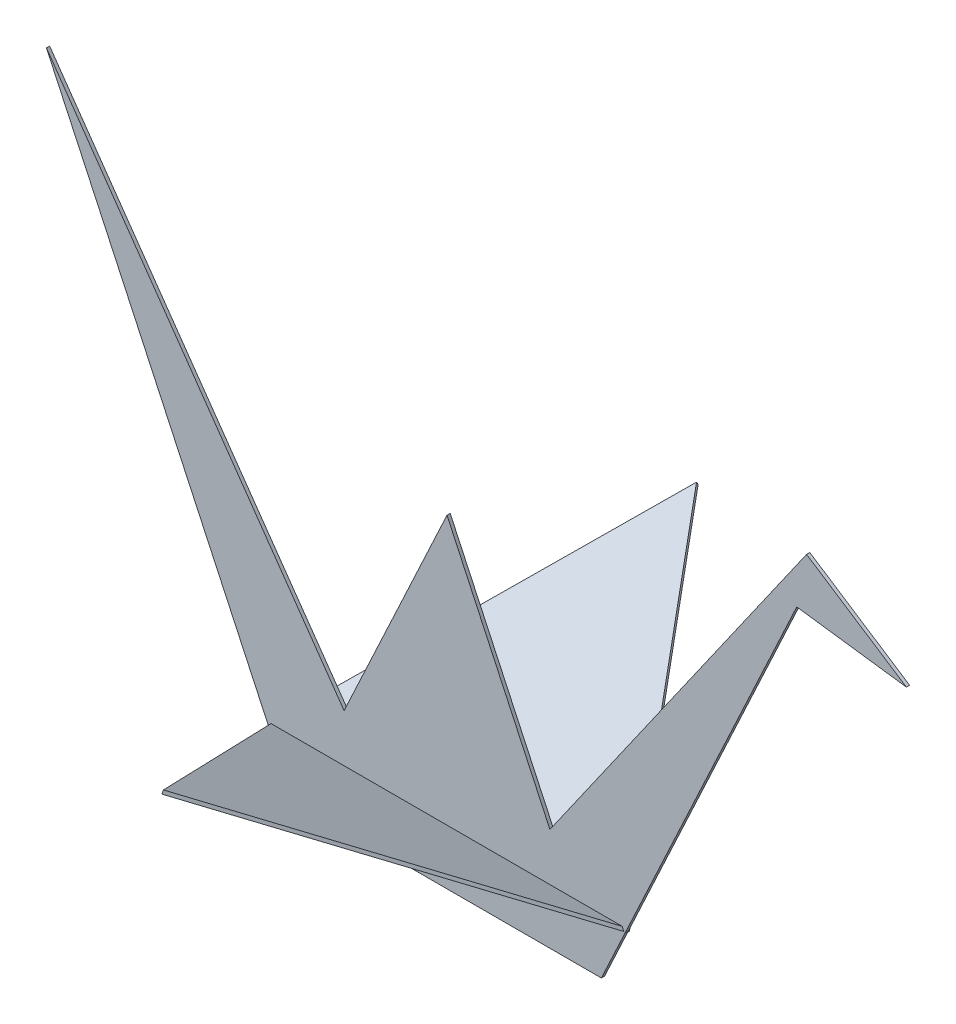
ISO-10303-21;
HEADER;
FILE_DESCRIPTION(('STEP AP214'),'2;1');
FILE_NAME('part.step','',(''),(''),'','','');
FILE_SCHEMA(('AUTOMOTIVE_DESIGN { 1 0 10303 214 1 1 1 1 }'));
ENDSEC;
DATA;
#1=APPLICATION_CONTEXT('core data for automotive mechanical design processes');
#2=APPLICATION_PROTOCOL_DEFINITION('international standard','automotive_design',2000,#1);
#3=PRODUCT_CONTEXT('',#1,'mechanical');
#4=PRODUCT('Part','Part','',(#3));
#5=PRODUCT_RELATED_PRODUCT_CATEGORY('part','',(#4));
#6=PRODUCT_DEFINITION_FORMATION('','',#4);
#7=PRODUCT_DEFINITION_CONTEXT('part definition',#1,'design');
#8=PRODUCT_DEFINITION('design','',#6,#7);
#9=PRODUCT_DEFINITION_SHAPE('','',#8);
#10=(LENGTH_UNIT() NAMED_UNIT(*) SI_UNIT(.MILLI.,.METRE.));
#11=(NAMED_UNIT(*) PLANE_ANGLE_UNIT() SI_UNIT($,.RADIAN.));
#12=(NAMED_UNIT(*) SI_UNIT($,.STERADIAN.) SOLID_ANGLE_UNIT());
#13=UNCERTAINTY_MEASURE_WITH_UNIT(LENGTH_MEASURE(1.E-05),#10,'distance_accuracy_value','');
#14=(GEOMETRIC_REPRESENTATION_CONTEXT(3) GLOBAL_UNCERTAINTY_ASSIGNED_CONTEXT((#13)) GLOBAL_UNIT_ASSIGNED_CONTEXT((#10,
#11,#12)) REPRESENTATION_CONTEXT('',''));
#15=CARTESIAN_POINT('',(0.,0.,0.));
#16=DIRECTION('',(0.,0.,1.));
#17=DIRECTION('',(1.,0.,0.));
#18=AXIS2_PLACEMENT_3D('',#15,#16,#17);
#19=CARTESIAN_POINT('',(0.,0.,6.35));
#20=DIRECTION('',(0.,0.,1.));
#21=DIRECTION('',(1.,0.,0.));
#22=AXIS2_PLACEMENT_3D('',#19,#20,#21);
#23=PLANE('',#22);
#24=DIRECTION('',(0.422618261740697,-0.906307787036651,0.));
#25=VECTOR('',#24,1.);
#26=CARTESIAN_POINT('',(-791.008562204168,1042.67762645785,6.35));
#27=LINE('',#26,#25);
#28=CARTESIAN_POINT('',(-791.008562204168,1042.67762645785,6.35));
#29=VERTEX_POINT('',#28);
#30=CARTESIAN_POINT('',(-304.8,0.,6.35));
#31=VERTEX_POINT('',#30);
#32=EDGE_CURVE('E356',#29,#31,#27,.T.);
#33=ORIENTED_EDGE('',*,*,#32,.T.);
#34=DIRECTION('',(1.,0.,0.));
#35=VECTOR('',#34,1.);
#36=CARTESIAN_POINT('',(-304.8,0.,6.35));
#37=LINE('',#36,#35);
#38=CARTESIAN_POINT('',(304.8,0.,6.35));
#39=VERTEX_POINT('',#38);
#40=EDGE_CURVE('E360',#31,#39,#37,.T.);
#41=ORIENTED_EDGE('',*,*,#40,.T.);
#42=DIRECTION('',(0.422618261740697,0.906307787036651,0.));
#43=VECTOR('',#42,1.);
#44=CARTESIAN_POINT('',(304.8,0.,6.35));
#45=LINE('',#44,#43);
#46=CARTESIAN_POINT('',(690.659261150894,827.477855880803,6.35));
#47=VERTEX_POINT('',#46);
#48=EDGE_CURVE('E364',#39,#47,#45,.T.);
#49=ORIENTED_EDGE('',*,*,#48,.T.);
#50=DIRECTION('',(0.991183026101507,-0.132499844408433,0.));
#51=VECTOR('',#50,1.);
#52=CARTESIAN_POINT('',(690.659261150894,827.477855880803,6.35));
#53=LINE('',#52,#51);
#54=CARTESIAN_POINT('',(907.061590086434,798.549520590036,6.35));
#55=VERTEX_POINT('',#54);
#56=EDGE_CURVE('E367',#47,#55,#53,.T.);
#57=ORIENTED_EDGE('',*,*,#56,.T.);
#58=DIRECTION('',(-0.837691740802453,0.546143339601753,0.));
#59=VECTOR('',#58,1.);
#60=CARTESIAN_POINT('',(907.061590086434,798.549520590036,6.35));
#61=LINE('',#60,#59);
#62=CARTESIAN_POINT('',(710.019622073524,927.01343304211,6.35));
#63=VERTEX_POINT('',#62);
#64=EDGE_CURVE('E370',#55,#63,#61,.T.);
#65=ORIENTED_EDGE('',*,*,#64,.T.);
#66=DIRECTION('',(-0.573576436351038,-0.819152044288997,0.));
#67=VECTOR('',#66,1.);
#68=CARTESIAN_POINT('',(710.019622073524,927.01343304211,6.35));
#69=LINE('',#68,#67);
#70=CARTESIAN_POINT('',(203.2,203.2,6.35));
#71=VERTEX_POINT('',#70);
#72=EDGE_CURVE('E373',#63,#71,#69,.T.);
#73=ORIENTED_EDGE('',*,*,#72,.T.);
#74=DIRECTION('',(-0.422618261740697,0.906307787036651,0.));
#75=VECTOR('',#74,1.);
#76=CARTESIAN_POINT('',(203.2,203.2,6.35));
#77=LINE('',#76,#75);
#78=CARTESIAN_POINT('',(0.,638.963806247545,6.35));
#79=VERTEX_POINT('',#78);
#80=EDGE_CURVE('E376',#71,#79,#77,.T.);
#81=ORIENTED_EDGE('',*,*,#80,.T.);
#82=DIRECTION('',(-0.422618261740697,-0.906307787036651,0.));
#83=VECTOR('',#82,1.);
#84=CARTESIAN_POINT('',(0.,638.963806247545,6.35));
#85=LINE('',#84,#83);
#86=CARTESIAN_POINT('',(-203.2,203.2,6.35));
#87=VERTEX_POINT('',#86);
#88=EDGE_CURVE('E379',#79,#87,#85,.T.);
#89=ORIENTED_EDGE('',*,*,#88,.T.);
#90=DIRECTION('',(-0.573576436351038,0.819152044288997,0.));
#91=VECTOR('',#90,1.);
#92=CARTESIAN_POINT('',(-203.2,203.2,6.35));
#93=LINE('',#92,#91);
#94=EDGE_CURVE('E382',#87,#29,#93,.T.);
#95=ORIENTED_EDGE('',*,*,#94,.T.);
#96=EDGE_LOOP('',(#33,#41,#49,#57,#65,#73,#81,#89,#95));
#97=FACE_BOUND('',#96,.T.);
#98=DIRECTION('',(-0.24802825701071,-0.968752798047174,0.));
#99=VECTOR('',#98,1.);
#100=CARTESIAN_POINT('',(-352.281184320446,90.193998201401,6.35));
#101=LINE('',#100,#99);
#102=CARTESIAN_POINT('',(-347.483633951535,108.932348418708,6.34999999999999));
#103=VERTEX_POINT('',#102);
#104=CARTESIAN_POINT('',(-349.36092359834,101.6,6.35000000000002));
#105=VERTEX_POINT('',#104);
#106=EDGE_CURVE('E295',#103,#105,#101,.T.);
#107=ORIENTED_EDGE('',*,*,#106,.F.);
#108=DIRECTION('',(1.,0.,0.));
#109=VECTOR('',#108,1.);
#110=CARTESIAN_POINT('',(0.,108.932348418708,6.35));
#111=LINE('',#110,#109);
#112=CARTESIAN_POINT('',(346.280009070548,108.932348418709,6.35000000000015));
#113=VERTEX_POINT('',#112);
#114=EDGE_CURVE('E288',#103,#113,#111,.T.);
#115=ORIENTED_EDGE('',*,*,#114,.T.);
#116=DIRECTION('',(-0.306234316605467,0.951956166707892,0.));
#117=VECTOR('',#116,1.);
#118=CARTESIAN_POINT('',(345.562195495355,111.163734721282,6.35));
#119=LINE('',#118,#117);
#120=CARTESIAN_POINT('',(348.638748669748,101.6,6.34999999999993));
#121=VERTEX_POINT('',#120);
#122=EDGE_CURVE('E315',#121,#113,#119,.T.);
#123=ORIENTED_EDGE('',*,*,#122,.F.);
#124=DIRECTION('',(1.,0.,0.));
#125=VECTOR('',#124,1.);
#126=CARTESIAN_POINT('',(0.,101.6,6.35));
#127=LINE('',#126,#125);
#128=EDGE_CURVE('E11',#105,#121,#127,.T.);
#129=ORIENTED_EDGE('',*,*,#128,.F.);
#130=EDGE_LOOP('',(#107,#115,#123,#129));
#131=FACE_BOUND('',#130,.T.);
#132=ADVANCED_FACE('F38',(#97,#131),#23,.T.);
#133=CARTESIAN_POINT('',(0.,0.,0.));
#134=DIRECTION('',(0.,0.,1.));
#135=DIRECTION('',(1.,0.,0.));
#136=AXIS2_PLACEMENT_3D('',#133,#134,#135);
#137=PLANE('',#136);
#138=DIRECTION('',(-1.,0.,0.));
#139=VECTOR('',#138,1.);
#140=CARTESIAN_POINT('',(0.,101.6,0.));
#141=LINE('',#140,#139);
#142=CARTESIAN_POINT('',(352.176858068548,101.6,0.));
#143=VERTEX_POINT('',#142);
#144=CARTESIAN_POINT('',(-352.176858068547,101.6,0.));
#145=VERTEX_POINT('',#144);
#146=EDGE_CURVE('E460',#143,#145,#141,.T.);
#147=ORIENTED_EDGE('',*,*,#146,.F.);
#148=DIRECTION('',(0.422618261740697,0.906307787036651,0.));
#149=VECTOR('',#148,1.);
#150=CARTESIAN_POINT('',(304.8,0.,0.));
#151=LINE('',#150,#149);
#152=CARTESIAN_POINT('',(304.8,0.,0.));
#153=VERTEX_POINT('',#152);
#154=EDGE_CURVE('E394',#153,#143,#151,.T.);
#155=ORIENTED_EDGE('',*,*,#154,.F.);
#156=DIRECTION('',(1.,0.,0.));
#157=VECTOR('',#156,1.);
#158=CARTESIAN_POINT('',(-304.8,0.,0.));
#159=LINE('',#158,#157);
#160=CARTESIAN_POINT('',(-304.8,0.,0.));
#161=VERTEX_POINT('',#160);
#162=EDGE_CURVE('E390',#161,#153,#159,.T.);
#163=ORIENTED_EDGE('',*,*,#162,.F.);
#164=DIRECTION('',(0.422618261740697,-0.906307787036651,0.));
#165=VECTOR('',#164,1.);
#166=CARTESIAN_POINT('',(-791.008562204168,1042.67762645785,0.));
#167=LINE('',#166,#165);
#168=EDGE_CURVE('E355',#145,#161,#167,.T.);
#169=ORIENTED_EDGE('',*,*,#168,.F.);
#170=EDGE_LOOP('',(#147,#155,#163,#169));
#171=FACE_BOUND('',#170,.T.);
#172=ADVANCED_FACE('F559',(#171),#137,.F.);
#173=DIRECTION('',(0.306234316605467,-0.951956166707892,0.));
#174=VECTOR('',#173,1.);
#175=CARTESIAN_POINT('',(348.768502917108,112.19517019748,0.));
#176=LINE('',#175,#174);
#177=CARTESIAN_POINT('',(350.997488268948,105.266174209354,0.));
#178=VERTEX_POINT('',#177);
#179=EDGE_CURVE('E456',#178,#143,#176,.T.);
#180=ORIENTED_EDGE('',*,*,#179,.F.);
#181=DIRECTION('',(1.,0.,0.));
#182=VECTOR('',#181,1.);
#183=CARTESIAN_POINT('',(0.,105.266174209354,0.));
#184=LINE('',#183,#182);
#185=CARTESIAN_POINT('',(-351.238213245145,105.266174209354,0.));
#186=VERTEX_POINT('',#185);
#187=EDGE_CURVE('E450',#186,#178,#184,.T.);
#188=ORIENTED_EDGE('',*,*,#187,.F.);
#189=DIRECTION('',(0.24802825701071,0.968752798047174,0.));
#190=VECTOR('',#189,1.);
#191=CARTESIAN_POINT('',(-354.923888088084,90.8706054954436,0.));
#192=LINE('',#191,#190);
#193=EDGE_CURVE('E232',#145,#186,#192,.T.);
#194=ORIENTED_EDGE('',*,*,#193,.F.);
#195=CARTESIAN_POINT('',(-791.008562204168,1042.67762645785,0.));
#196=VERTEX_POINT('',#195);
#197=EDGE_CURVE('E386',#196,#145,#167,.T.);
#198=ORIENTED_EDGE('',*,*,#197,.F.);
#199=DIRECTION('',(-0.573576436351038,0.819152044288997,0.));
#200=VECTOR('',#199,1.);
#201=CARTESIAN_POINT('',(-203.2,203.2,0.));
#202=LINE('',#201,#200);
#203=CARTESIAN_POINT('',(-203.2,203.2,0.));
#204=VERTEX_POINT('',#203);
#205=EDGE_CURVE('E361',#204,#196,#202,.T.);
#206=ORIENTED_EDGE('',*,*,#205,.F.);
#207=DIRECTION('',(-0.422618261740697,-0.906307787036651,0.));
#208=VECTOR('',#207,1.);
#209=CARTESIAN_POINT('',(0.,638.963806247545,0.));
#210=LINE('',#209,#208);
#211=CARTESIAN_POINT('',(0.,638.963806247545,0.));
#212=VERTEX_POINT('',#211);
#213=EDGE_CURVE('E410',#212,#204,#210,.T.);
#214=ORIENTED_EDGE('',*,*,#213,.F.);
#215=DIRECTION('',(-0.422618261740697,0.906307787036651,0.));
#216=VECTOR('',#215,1.);
#217=CARTESIAN_POINT('',(203.2,203.2,0.));
#218=LINE('',#217,#216);
#219=CARTESIAN_POINT('',(203.2,203.2,0.));
#220=VERTEX_POINT('',#219);
#221=EDGE_CURVE('E407',#220,#212,#218,.T.);
#222=ORIENTED_EDGE('',*,*,#221,.F.);
#223=DIRECTION('',(-0.573576436351038,-0.819152044288997,0.));
#224=VECTOR('',#223,1.);
#225=CARTESIAN_POINT('',(710.019622073524,927.01343304211,0.));
#226=LINE('',#225,#224);
#227=CARTESIAN_POINT('',(710.019622073524,927.01343304211,0.));
#228=VERTEX_POINT('',#227);
#229=EDGE_CURVE('E404',#228,#220,#226,.T.);
#230=ORIENTED_EDGE('',*,*,#229,.F.);
#231=DIRECTION('',(-0.837691740802453,0.546143339601753,0.));
#232=VECTOR('',#231,1.);
#233=CARTESIAN_POINT('',(907.061590086434,798.549520590036,0.));
#234=LINE('',#233,#232);
#235=CARTESIAN_POINT('',(907.061590086434,798.549520590036,0.));
#236=VERTEX_POINT('',#235);
#237=EDGE_CURVE('E401',#236,#228,#234,.T.);
#238=ORIENTED_EDGE('',*,*,#237,.F.);
#239=DIRECTION('',(0.991183026101507,-0.132499844408433,0.));
#240=VECTOR('',#239,1.);
#241=CARTESIAN_POINT('',(690.659261150894,827.477855880803,0.));
#242=LINE('',#241,#240);
#243=CARTESIAN_POINT('',(690.659261150894,827.477855880803,0.));
#244=VERTEX_POINT('',#243);
#245=EDGE_CURVE('E398',#244,#236,#242,.T.);
#246=ORIENTED_EDGE('',*,*,#245,.F.);
#247=EDGE_CURVE('E393',#143,#244,#151,.T.);
#248=ORIENTED_EDGE('',*,*,#247,.F.);
#249=EDGE_LOOP('',(#180,#188,#194,#198,#206,#214,#222,#230,#238,#246,#248));
#250=FACE_BOUND('',#249,.T.);
#251=ADVANCED_FACE('F474',(#250),#137,.F.);
#252=CARTESIAN_POINT('',(-791.008562204168,1042.67762645785,6.35));
#253=DIRECTION('',(0.906307787036651,0.422618261740697,0.));
#254=DIRECTION('',(-0.422618261740697,0.906307787036651,0.));
#255=AXIS2_PLACEMENT_3D('',#252,#253,#254);
#256=PLANE('',#255);
#257=DIRECTION('',(0.22706382303561,-0.486939939897226,-0.843404716136529));
#258=VECTOR('',#257,1.);
#259=CARTESIAN_POINT('',(-478.853741182991,373.259452507507,476.877974099345));
#260=LINE('',#259,#258);
#261=CARTESIAN_POINT('',(-351.295837552501,99.7106454062273,3.07754185007221));
#262=VERTEX_POINT('',#261);
#263=CARTESIAN_POINT('',(-350.894684236083,98.8503693429842,1.58749999999991));
#264=VERTEX_POINT('',#263);
#265=EDGE_CURVE('E323',#262,#264,#260,.T.);
#266=ORIENTED_EDGE('',*,*,#265,.T.);
#267=DIRECTION('',(-0.374453581814995,0.803018297611854,-0.4636228302904));
#268=VECTOR('',#267,1.);
#269=CARTESIAN_POINT('',(-695.580993013443,838.032543920932,-425.179527472752));
#270=LINE('',#269,#268);
#271=EDGE_CURVE('E307',#264,#145,#270,.T.);
#272=ORIENTED_EDGE('',*,*,#271,.T.);
#273=ORIENTED_EDGE('',*,*,#168,.T.);
#274=DIRECTION('',(0.,0.,-1.));
#275=VECTOR('',#274,1.);
#276=CARTESIAN_POINT('',(-304.8,0.,6.35));
#277=LINE('',#276,#275);
#278=EDGE_CURVE('E446',#31,#161,#277,.T.);
#279=ORIENTED_EDGE('',*,*,#278,.F.);
#280=ORIENTED_EDGE('',*,*,#32,.F.);
#281=DIRECTION('',(0.,0.,-1.));
#282=VECTOR('',#281,1.);
#283=CARTESIAN_POINT('',(-791.008562204168,1042.67762645785,6.35));
#284=LINE('',#283,#282);
#285=EDGE_CURVE('E385',#29,#196,#284,.T.);
#286=ORIENTED_EDGE('',*,*,#285,.T.);
#287=ORIENTED_EDGE('',*,*,#197,.T.);
#288=DIRECTION('',(0.237015762498959,-0.508281942948871,0.827932965160319));
#289=VECTOR('',#288,1.);
#290=CARTESIAN_POINT('',(-488.955199172231,394.922099072667,-477.78804382337));
#291=LINE('',#290,#289);
#292=EDGE_CURVE('E291',#145,#262,#291,.T.);
#293=ORIENTED_EDGE('',*,*,#292,.T.);
#294=EDGE_LOOP('',(#266,#272,#273,#279,#280,#286,#287,#293));
#295=FACE_BOUND('',#294,.T.);
#296=ADVANCED_FACE('F40',(#295),#256,.F.);
#297=CARTESIAN_POINT('',(-304.8,0.,6.35));
#298=DIRECTION('',(0.,1.,0.));
#299=DIRECTION('',(0.,0.,1.));
#300=AXIS2_PLACEMENT_3D('',#297,#298,#299);
#301=PLANE('',#300);
#302=ORIENTED_EDGE('',*,*,#162,.T.);
#303=DIRECTION('',(0.,0.,-1.));
#304=VECTOR('',#303,1.);
#305=CARTESIAN_POINT('',(304.8,0.,6.35));
#306=LINE('',#305,#304);
#307=EDGE_CURVE('E442',#39,#153,#306,.T.);
#308=ORIENTED_EDGE('',*,*,#307,.F.);
#309=ORIENTED_EDGE('',*,*,#40,.F.);
#310=ORIENTED_EDGE('',*,*,#278,.T.);
#311=EDGE_LOOP('',(#302,#308,#309,#310));
#312=FACE_BOUND('',#311,.T.);
#313=ADVANCED_FACE('F583',(#312),#301,.F.);
#314=CARTESIAN_POINT('',(304.8,0.,6.35));
#315=DIRECTION('',(-0.906307787036651,0.422618261740697,0.));
#316=DIRECTION('',(-0.422618261740697,-0.906307787036651,0.));
#317=AXIS2_PLACEMENT_3D('',#314,#315,#316);
#318=PLANE('',#317);
#319=ORIENTED_EDGE('',*,*,#154,.T.);
#320=DIRECTION('',(-0.374453581814994,-0.803018297611854,0.4636228302904));
#321=VECTOR('',#320,1.);
#322=CARTESIAN_POINT('',(313.881079028178,19.474436821622,47.4152160083864));
#323=LINE('',#322,#321);
#324=CARTESIAN_POINT('',(350.894684236084,98.8503693429845,1.5875));
#325=VERTEX_POINT('',#324);
#326=EDGE_CURVE('E299',#143,#325,#323,.T.);
#327=ORIENTED_EDGE('',*,*,#326,.T.);
#328=DIRECTION('',(0.227063823035609,0.486939939897226,0.843404716136529));
#329=VECTOR('',#328,1.);
#330=CARTESIAN_POINT('',(338.500652235379,72.2712819444562,-44.4488297930647));
#331=LINE('',#330,#329);
#332=CARTESIAN_POINT('',(351.235736754739,99.5817588294984,2.8543037507637));
#333=VERTEX_POINT('',#332);
#334=EDGE_CURVE('E319',#325,#333,#331,.T.);
#335=ORIENTED_EDGE('',*,*,#334,.T.);
#336=DIRECTION('',(0.259961831884461,0.557489947544574,-0.788431864113839));
#337=VECTOR('',#336,1.);
#338=CARTESIAN_POINT('',(332.949120210214,60.36598309706,58.3153345721757));
#339=LINE('',#338,#337);
#340=EDGE_CURVE('E311',#333,#143,#339,.T.);
#341=ORIENTED_EDGE('',*,*,#340,.T.);
#342=ORIENTED_EDGE('',*,*,#247,.T.);
#343=DIRECTION('',(0.,0.,-1.));
#344=VECTOR('',#343,1.);
#345=CARTESIAN_POINT('',(690.659261150894,827.477855880803,6.35));
#346=LINE('',#345,#344);
#347=EDGE_CURVE('E438',#47,#244,#346,.T.);
#348=ORIENTED_EDGE('',*,*,#347,.F.);
#349=ORIENTED_EDGE('',*,*,#48,.F.);
#350=ORIENTED_EDGE('',*,*,#307,.T.);
#351=EDGE_LOOP('',(#319,#327,#335,#341,#342,#348,#349,#350));
#352=FACE_BOUND('',#351,.T.);
#353=ADVANCED_FACE('F512',(#352),#318,.F.);
#354=CARTESIAN_POINT('',(690.659261150894,827.477855880803,6.35));
#355=DIRECTION('',(0.132499844408433,0.991183026101507,0.));
#356=DIRECTION('',(-0.991183026101507,0.132499844408433,0.));
#357=AXIS2_PLACEMENT_3D('',#354,#355,#356);
#358=PLANE('',#357);
#359=ORIENTED_EDGE('',*,*,#245,.T.);
#360=DIRECTION('',(0.,0.,-1.));
#361=VECTOR('',#360,1.);
#362=CARTESIAN_POINT('',(907.061590086434,798.549520590036,6.35));
#363=LINE('',#362,#361);
#364=EDGE_CURVE('E434',#55,#236,#363,.T.);
#365=ORIENTED_EDGE('',*,*,#364,.F.);
#366=ORIENTED_EDGE('',*,*,#56,.F.);
#367=ORIENTED_EDGE('',*,*,#347,.T.);
#368=EDGE_LOOP('',(#359,#365,#366,#367));
#369=FACE_BOUND('',#368,.T.);
#370=ADVANCED_FACE('F508',(#369),#358,.F.);
#371=CARTESIAN_POINT('',(907.061590086434,798.549520590036,6.35));
#372=DIRECTION('',(-0.546143339601753,-0.837691740802453,0.));
#373=DIRECTION('',(0.837691740802453,-0.546143339601753,0.));
#374=AXIS2_PLACEMENT_3D('',#371,#372,#373);
#375=PLANE('',#374);
#376=ORIENTED_EDGE('',*,*,#237,.T.);
#377=DIRECTION('',(0.,0.,-1.));
#378=VECTOR('',#377,1.);
#379=CARTESIAN_POINT('',(710.019622073524,927.01343304211,6.35));
#380=LINE('',#379,#378);
#381=EDGE_CURVE('E430',#63,#228,#380,.T.);
#382=ORIENTED_EDGE('',*,*,#381,.F.);
#383=ORIENTED_EDGE('',*,*,#64,.F.);
#384=ORIENTED_EDGE('',*,*,#364,.T.);
#385=EDGE_LOOP('',(#376,#382,#383,#384));
#386=FACE_BOUND('',#385,.T.);
#387=ADVANCED_FACE('F503',(#386),#375,.F.);
#388=CARTESIAN_POINT('',(710.019622073524,927.01343304211,6.35));
#389=DIRECTION('',(0.819152044288997,-0.573576436351038,0.));
#390=DIRECTION('',(0.573576436351038,0.819152044288997,0.));
#391=AXIS2_PLACEMENT_3D('',#388,#389,#390);
#392=PLANE('',#391);
#393=ORIENTED_EDGE('',*,*,#229,.T.);
#394=DIRECTION('',(0.,0.,-1.));
#395=VECTOR('',#394,1.);
#396=CARTESIAN_POINT('',(203.2,203.2,6.35));
#397=LINE('',#396,#395);
#398=EDGE_CURVE('E426',#71,#220,#397,.T.);
#399=ORIENTED_EDGE('',*,*,#398,.F.);
#400=ORIENTED_EDGE('',*,*,#72,.F.);
#401=ORIENTED_EDGE('',*,*,#381,.T.);
#402=EDGE_LOOP('',(#393,#399,#400,#401));
#403=FACE_BOUND('',#402,.T.);
#404=ADVANCED_FACE('F497',(#403),#392,.F.);
#405=CARTESIAN_POINT('',(203.2,203.2,6.35));
#406=DIRECTION('',(-0.906307787036651,-0.422618261740697,0.));
#407=DIRECTION('',(0.422618261740697,-0.906307787036651,0.));
#408=AXIS2_PLACEMENT_3D('',#405,#406,#407);
#409=PLANE('',#408);
#410=ORIENTED_EDGE('',*,*,#221,.T.);
#411=DIRECTION('',(0.,0.,-1.));
#412=VECTOR('',#411,1.);
#413=CARTESIAN_POINT('',(0.,638.963806247545,6.35));
#414=LINE('',#413,#412);
#415=EDGE_CURVE('E422',#79,#212,#414,.T.);
#416=ORIENTED_EDGE('',*,*,#415,.F.);
#417=ORIENTED_EDGE('',*,*,#80,.F.);
#418=ORIENTED_EDGE('',*,*,#398,.T.);
#419=EDGE_LOOP('',(#410,#416,#417,#418));
#420=FACE_BOUND('',#419,.T.);
#421=ADVANCED_FACE('F493',(#420),#409,.F.);
#422=CARTESIAN_POINT('',(0.,638.963806247545,6.35));
#423=DIRECTION('',(0.906307787036651,-0.422618261740697,0.));
#424=DIRECTION('',(0.422618261740697,0.906307787036651,0.));
#425=AXIS2_PLACEMENT_3D('',#422,#423,#424);
#426=PLANE('',#425);
#427=ORIENTED_EDGE('',*,*,#213,.T.);
#428=DIRECTION('',(0.,0.,-1.));
#429=VECTOR('',#428,1.);
#430=CARTESIAN_POINT('',(-203.2,203.2,6.35));
#431=LINE('',#430,#429);
#432=EDGE_CURVE('E418',#87,#204,#431,.T.);
#433=ORIENTED_EDGE('',*,*,#432,.F.);
#434=ORIENTED_EDGE('',*,*,#88,.F.);
#435=ORIENTED_EDGE('',*,*,#415,.T.);
#436=EDGE_LOOP('',(#427,#433,#434,#435));
#437=FACE_BOUND('',#436,.T.);
#438=ADVANCED_FACE('F488',(#437),#426,.F.);
#439=CARTESIAN_POINT('',(-203.2,203.2,6.35));
#440=DIRECTION('',(-0.819152044288997,-0.573576436351038,0.));
#441=DIRECTION('',(0.573576436351038,-0.819152044288997,0.));
#442=AXIS2_PLACEMENT_3D('',#439,#440,#441);
#443=PLANE('',#442);
#444=ORIENTED_EDGE('',*,*,#205,.T.);
#445=ORIENTED_EDGE('',*,*,#285,.F.);
#446=ORIENTED_EDGE('',*,*,#94,.F.);
#447=ORIENTED_EDGE('',*,*,#432,.T.);
#448=EDGE_LOOP('',(#444,#445,#446,#447));
#449=FACE_BOUND('',#448,.T.);
#450=ADVANCED_FACE('F482',(#449),#443,.F.);
#451=CARTESIAN_POINT('',(352.176858068548,104.349630657016,1.5875));
#452=DIRECTION('',(0.,0.500000000000001,-0.866025403784438));
#453=DIRECTION('',(0.,0.866025403784438,0.500000000000001));
#454=AXIS2_PLACEMENT_3D('',#451,#452,#453);
#455=PLANE('',#454);
#456=DIRECTION('',(0.,-0.866025403784438,-0.500000000000001));
#457=VECTOR('',#456,1.);
#458=CARTESIAN_POINT('',(352.176858068548,104.349630657016,1.5875));
#459=LINE('',#458,#457);
#460=CARTESIAN_POINT('',(352.176858068548,98.8503693429845,-1.5875));
#461=VERTEX_POINT('',#460);
#462=EDGE_CURVE('E352',#143,#461,#459,.T.);
#463=ORIENTED_EDGE('',*,*,#462,.F.);
#464=ORIENTED_EDGE('',*,*,#146,.T.);
#465=DIRECTION('',(0.,-0.866025403784438,-0.500000000000001));
#466=VECTOR('',#465,1.);
#467=CARTESIAN_POINT('',(-352.176858068547,104.349630657016,1.58750000000001));
#468=LINE('',#467,#466);
#469=CARTESIAN_POINT('',(-352.176858068547,98.8503693429844,-1.5875));
#470=VERTEX_POINT('',#469);
#471=EDGE_CURVE('E336',#145,#470,#468,.T.);
#472=ORIENTED_EDGE('',*,*,#471,.T.);
#473=DIRECTION('',(1.,0.,0.));
#474=VECTOR('',#473,1.);
#475=CARTESIAN_POINT('',(352.176858068548,98.8503693429845,-1.5875));
#476=LINE('',#475,#474);
#477=EDGE_CURVE('E327',#470,#461,#476,.T.);
#478=ORIENTED_EDGE('',*,*,#477,.T.);
#479=EDGE_LOOP('',(#463,#464,#472,#478));
#480=FACE_BOUND('',#479,.T.);
#481=ADVANCED_FACE('F529',(#480),#455,.F.);
#482=CARTESIAN_POINT('',(-40.0269973847572,409.149630657016,-526.341586146993));
#483=DIRECTION('',(-0.8409787765962,-0.270534053916859,0.468578726561576));
#484=DIRECTION('',(0.486728639972067,0.,0.873553221636176));
#485=AXIS2_PLACEMENT_3D('',#482,#483,#484);
#486=PLANE('',#485);
#487=DIRECTION('',(0.306234316605465,0.475978083353947,0.824418223658288));
#488=VECTOR('',#487,1.);
#489=CARTESIAN_POINT('',(225.738818999503,-89.4225921680203,-337.210835028519));
#490=LINE('',#489,#488);
#491=CARTESIAN_POINT('',(350.407803369148,104.349630657016,-1.58749999999996));
#492=VERTEX_POINT('',#491);
#493=EDGE_CURVE('E284',#492,#178,#490,.T.);
#494=ORIENTED_EDGE('',*,*,#493,.F.);
#495=DIRECTION('',(0.486728639972068,-0.756519281494666,0.436776610818089));
#496=VECTOR('',#495,1.);
#497=CARTESIAN_POINT('',(34.1202469350612,595.953401811617,-285.415069610745));
#498=LINE('',#497,#496);
#499=EDGE_CURVE('E303',#492,#143,#498,.T.);
#500=ORIENTED_EDGE('',*,*,#499,.T.);
#501=ORIENTED_EDGE('',*,*,#462,.T.);
#502=DIRECTION('',(-0.541068107833716,0.420489388298101,-0.728308984575867));
#503=VECTOR('',#502,1.);
#504=CARTESIAN_POINT('',(-40.0269973847572,403.650369342985,-529.516586146993));
#505=LINE('',#504,#503);
#506=CARTESIAN_POINT('',(-40.0269973847572,403.650369342985,-529.516586146993));
#507=VERTEX_POINT('',#506);
#508=EDGE_CURVE('E340',#461,#507,#505,.T.);
#509=ORIENTED_EDGE('',*,*,#508,.T.);
#510=DIRECTION('',(0.,-0.866025403784438,-0.500000000000001));
#511=VECTOR('',#510,1.);
#512=CARTESIAN_POINT('',(-40.0269973847572,409.149630657016,-526.341586146993));
#513=LINE('',#512,#511);
#514=CARTESIAN_POINT('',(-40.0269973847572,409.149630657016,-526.341586146993));
#515=VERTEX_POINT('',#514);
#516=EDGE_CURVE('E348',#515,#507,#513,.T.);
#517=ORIENTED_EDGE('',*,*,#516,.F.);
#518=DIRECTION('',(-0.541068107833716,0.420489388298101,-0.728308984575867));
#519=VECTOR('',#518,1.);
#520=CARTESIAN_POINT('',(-40.0269973847572,409.149630657016,-526.341586146993));
#521=LINE('',#520,#519);
#522=EDGE_CURVE('E328',#178,#515,#521,.T.);
#523=ORIENTED_EDGE('',*,*,#522,.F.);
#524=EDGE_LOOP('',(#494,#500,#501,#509,#517,#523));
#525=FACE_BOUND('',#524,.T.);
#526=ADVANCED_FACE('F542',(#525),#486,.F.);
#527=CARTESIAN_POINT('',(-352.176858068547,104.349630657016,1.58750000000001));
#528=DIRECTION('',(0.8900932941707,-0.227889187804266,0.394715651772593));
#529=DIRECTION('',(0.405382450184491,0.,-0.914147181302015));
#530=AXIS2_PLACEMENT_3D('',#527,#528,#529);
#531=PLANE('',#530);
#532=ORIENTED_EDGE('',*,*,#471,.F.);
#533=DIRECTION('',(0.405382450184492,0.791674681805483,-0.457073590651008));
#534=VECTOR('',#533,1.);
#535=CARTESIAN_POINT('',(-351.588563550153,102.748885146473,-0.663309148584171));
#536=LINE('',#535,#534);
#537=CARTESIAN_POINT('',(-350.768890833444,104.349630657016,-1.58750000000001));
#538=VERTEX_POINT('',#537);
#539=EDGE_CURVE('E47',#145,#538,#536,.T.);
#540=ORIENTED_EDGE('',*,*,#539,.T.);
#541=DIRECTION('',(0.248028257010709,-0.484376399023588,-0.838964533096108));
#542=VECTOR('',#541,1.);
#543=CARTESIAN_POINT('',(-351.516182126638,105.809021897279,0.940239776256677));
#544=LINE('',#543,#542);
#545=EDGE_CURVE('E245',#186,#538,#544,.T.);
#546=ORIENTED_EDGE('',*,*,#545,.F.);
#547=DIRECTION('',(-0.455778375608531,-0.445046647085351,0.770843404490002));
#548=VECTOR('',#547,1.);
#549=CARTESIAN_POINT('',(-352.176858068547,104.349630657016,1.58750000000001));
#550=LINE('',#549,#548);
#551=EDGE_CURVE('E331',#515,#186,#550,.T.);
#552=ORIENTED_EDGE('',*,*,#551,.F.);
#553=ORIENTED_EDGE('',*,*,#516,.T.);
#554=DIRECTION('',(-0.455778375608531,-0.445046647085351,0.770843404490002));
#555=VECTOR('',#554,1.);
#556=CARTESIAN_POINT('',(-352.176858068547,98.8503693429844,-1.5875));
#557=LINE('',#556,#555);
#558=EDGE_CURVE('E332',#507,#470,#557,.T.);
#559=ORIENTED_EDGE('',*,*,#558,.T.);
#560=EDGE_LOOP('',(#532,#540,#546,#552,#553,#559));
#561=FACE_BOUND('',#560,.T.);
#562=ADVANCED_FACE('F465',(#561),#531,.F.);
#563=CARTESIAN_POINT('',(0.,78.9496306570156,45.5815905122496));
#564=DIRECTION('',(0.,-0.866025403784438,-0.500000000000001));
#565=DIRECTION('',(0.,0.500000000000001,-0.866025403784438));
#566=AXIS2_PLACEMENT_3D('',#563,#564,#565);
#567=PLANE('',#566);
#568=ORIENTED_EDGE('',*,*,#551,.T.);
#569=ORIENTED_EDGE('',*,*,#187,.T.);
#570=ORIENTED_EDGE('',*,*,#522,.T.);
#571=EDGE_LOOP('',(#568,#569,#570));
#572=FACE_BOUND('',#571,.T.);
#573=ADVANCED_FACE('F545',(#572),#567,.F.);
#574=CARTESIAN_POINT('',(0.,73.4503693429844,42.4065905122496));
#575=DIRECTION('',(0.,-0.866025403784438,-0.500000000000001));
#576=DIRECTION('',(0.,0.500000000000001,-0.866025403784438));
#577=AXIS2_PLACEMENT_3D('',#574,#575,#576);
#578=PLANE('',#577);
#579=ORIENTED_EDGE('',*,*,#477,.F.);
#580=ORIENTED_EDGE('',*,*,#558,.F.);
#581=ORIENTED_EDGE('',*,*,#508,.F.);
#582=EDGE_LOOP('',(#579,#580,#581));
#583=FACE_BOUND('',#582,.T.);
#584=ADVANCED_FACE('F547',(#583),#578,.T.);
#585=CARTESIAN_POINT('',(0.,78.9496306570156,-45.5815905122496));
#586=DIRECTION('',(0.,-0.866025403784438,0.500000000000001));
#587=DIRECTION('',(0.,0.500000000000001,0.866025403784438));
#588=AXIS2_PLACEMENT_3D('',#585,#586,#587);
#589=PLANE('',#588);
#590=DIRECTION('',(-0.455778375608531,-0.445046647085351,-0.770843404490002));
#591=VECTOR('',#590,1.);
#592=CARTESIAN_POINT('',(-352.176858068547,104.349630657016,-1.58750000000001));
#593=LINE('',#592,#591);
#594=CARTESIAN_POINT('',(-352.176858068547,104.349630657016,-1.58750000000001));
#595=VERTEX_POINT('',#594);
#596=EDGE_CURVE('E227',#186,#595,#593,.T.);
#597=ORIENTED_EDGE('',*,*,#596,.F.);
#598=ORIENTED_EDGE('',*,*,#545,.T.);
#599=DIRECTION('',(1.,0.,0.));
#600=VECTOR('',#599,1.);
#601=CARTESIAN_POINT('',(352.176858068548,104.349630657016,-1.5875));
#602=LINE('',#601,#600);
#603=EDGE_CURVE('E238',#595,#538,#602,.T.);
#604=ORIENTED_EDGE('',*,*,#603,.F.);
#605=EDGE_LOOP('',(#597,#598,#604));
#606=FACE_BOUND('',#605,.T.);
#607=ADVANCED_FACE('F247',(#606),#589,.F.);
#608=CARTESIAN_POINT('',(-352.176858068547,104.349630657016,-1.58750000000001));
#609=DIRECTION('',(-0.8900932941707,0.227889187804266,0.394715651772593));
#610=DIRECTION('',(0.405382450184491,0.,0.914147181302015));
#611=AXIS2_PLACEMENT_3D('',#608,#609,#610);
#612=PLANE('',#611);
#613=ORIENTED_EDGE('',*,*,#193,.T.);
#614=ORIENTED_EDGE('',*,*,#596,.T.);
#615=DIRECTION('',(0.,-0.866025403784438,0.500000000000001));
#616=VECTOR('',#615,1.);
#617=CARTESIAN_POINT('',(-352.176858068547,104.349630657016,-1.58750000000001));
#618=LINE('',#617,#616);
#619=EDGE_CURVE('E230',#595,#145,#618,.T.);
#620=ORIENTED_EDGE('',*,*,#619,.T.);
#621=EDGE_LOOP('',(#613,#614,#620));
#622=FACE_BOUND('',#621,.T.);
#623=ADVANCED_FACE('F229',(#622),#612,.T.);
#624=CARTESIAN_POINT('',(352.176858068548,104.349630657016,-1.5875));
#625=DIRECTION('',(0.,-0.500000000000001,-0.866025403784438));
#626=DIRECTION('',(0.,0.866025403784438,-0.500000000000001));
#627=AXIS2_PLACEMENT_3D('',#624,#625,#626);
#628=PLANE('',#627);
#629=ORIENTED_EDGE('',*,*,#539,.F.);
#630=ORIENTED_EDGE('',*,*,#619,.F.);
#631=ORIENTED_EDGE('',*,*,#603,.T.);
#632=EDGE_LOOP('',(#629,#630,#631));
#633=FACE_BOUND('',#632,.T.);
#634=ADVANCED_FACE('F243',(#633),#628,.T.);
#635=CARTESIAN_POINT('',(352.176858068548,104.349630657016,-1.5875));
#636=VERTEX_POINT('',#635);
#637=EDGE_CURVE('E249',#492,#636,#602,.T.);
#638=ORIENTED_EDGE('',*,*,#637,.F.);
#639=ORIENTED_EDGE('',*,*,#493,.T.);
#640=DIRECTION('',(-0.541068107833716,0.420489388298101,0.728308984575867));
#641=VECTOR('',#640,1.);
#642=CARTESIAN_POINT('',(-40.0269973847572,409.149630657016,526.341586146993));
#643=LINE('',#642,#641);
#644=EDGE_CURVE('E258',#636,#178,#643,.T.);
#645=ORIENTED_EDGE('',*,*,#644,.F.);
#646=EDGE_LOOP('',(#638,#639,#645));
#647=FACE_BOUND('',#646,.T.);
#648=ADVANCED_FACE('F541',(#647),#589,.F.);
#649=CARTESIAN_POINT('',(-40.0269973847572,409.149630657016,526.341586146993));
#650=DIRECTION('',(0.8409787765962,0.270534053916859,0.468578726561576));
#651=DIRECTION('',(0.486728639972067,0.,-0.873553221636176));
#652=AXIS2_PLACEMENT_3D('',#649,#650,#651);
#653=PLANE('',#652);
#654=ORIENTED_EDGE('',*,*,#179,.T.);
#655=DIRECTION('',(0.,-0.866025403784438,0.500000000000001));
#656=VECTOR('',#655,1.);
#657=CARTESIAN_POINT('',(352.176858068548,104.349630657016,-1.5875));
#658=LINE('',#657,#656);
#659=EDGE_CURVE('E274',#636,#143,#658,.T.);
#660=ORIENTED_EDGE('',*,*,#659,.F.);
#661=ORIENTED_EDGE('',*,*,#644,.T.);
#662=EDGE_LOOP('',(#654,#660,#661));
#663=FACE_BOUND('',#662,.T.);
#664=ADVANCED_FACE('F534',(#663),#653,.T.);
#665=ORIENTED_EDGE('',*,*,#499,.F.);
#666=ORIENTED_EDGE('',*,*,#637,.T.);
#667=ORIENTED_EDGE('',*,*,#659,.T.);
#668=EDGE_LOOP('',(#665,#666,#667));
#669=FACE_BOUND('',#668,.T.);
#670=ADVANCED_FACE('F538',(#669),#628,.T.);
#671=ORIENTED_EDGE('',*,*,#114,.F.);
#672=CARTESIAN_POINT('',(-40.0269973847572,409.149630657016,526.341586146993));
#673=VERTEX_POINT('',#672);
#674=EDGE_CURVE('E237',#673,#103,#593,.T.);
#675=ORIENTED_EDGE('',*,*,#674,.F.);
#676=EDGE_CURVE('E257',#113,#673,#643,.T.);
#677=ORIENTED_EDGE('',*,*,#676,.F.);
#678=EDGE_LOOP('',(#671,#675,#677));
#679=FACE_BOUND('',#678,.T.);
#680=ADVANCED_FACE('F555',(#679),#589,.F.);
#681=CARTESIAN_POINT('',(0.,73.4503693429844,-42.4065905122496));
#682=DIRECTION('',(0.,-0.866025403784438,0.500000000000001));
#683=DIRECTION('',(0.,0.500000000000001,0.866025403784438));
#684=AXIS2_PLACEMENT_3D('',#681,#682,#683);
#685=PLANE('',#684);
#686=DIRECTION('',(-0.455778375608531,-0.445046647085351,-0.770843404490002));
#687=VECTOR('',#686,1.);
#688=CARTESIAN_POINT('',(-352.176858068547,98.8503693429844,1.5875));
#689=LINE('',#688,#687);
#690=CARTESIAN_POINT('',(-40.0269973847572,403.650369342985,529.516586146993));
#691=VERTEX_POINT('',#690);
#692=EDGE_CURVE('E267',#691,#105,#689,.T.);
#693=ORIENTED_EDGE('',*,*,#692,.T.);
#694=ORIENTED_EDGE('',*,*,#128,.T.);
#695=DIRECTION('',(-0.541068107833716,0.420489388298101,0.728308984575867));
#696=VECTOR('',#695,1.);
#697=CARTESIAN_POINT('',(-40.0269973847572,403.650369342985,529.516586146993));
#698=LINE('',#697,#696);
#699=EDGE_CURVE('E271',#121,#691,#698,.T.);
#700=ORIENTED_EDGE('',*,*,#699,.T.);
#701=EDGE_LOOP('',(#693,#694,#700));
#702=FACE_BOUND('',#701,.T.);
#703=ADVANCED_FACE('F609',(#702),#685,.T.);
#704=ORIENTED_EDGE('',*,*,#699,.F.);
#705=ORIENTED_EDGE('',*,*,#122,.T.);
#706=ORIENTED_EDGE('',*,*,#676,.T.);
#707=DIRECTION('',(0.,-0.866025403784438,0.500000000000001));
#708=VECTOR('',#707,1.);
#709=CARTESIAN_POINT('',(-40.0269973847572,409.149630657016,526.341586146993));
#710=LINE('',#709,#708);
#711=EDGE_CURVE('E278',#673,#691,#710,.T.);
#712=ORIENTED_EDGE('',*,*,#711,.T.);
#713=EDGE_LOOP('',(#704,#705,#706,#712));
#714=FACE_BOUND('',#713,.T.);
#715=ADVANCED_FACE('F621',(#714),#653,.T.);
#716=ORIENTED_EDGE('',*,*,#674,.T.);
#717=ORIENTED_EDGE('',*,*,#106,.T.);
#718=ORIENTED_EDGE('',*,*,#692,.F.);
#719=ORIENTED_EDGE('',*,*,#711,.F.);
#720=EDGE_LOOP('',(#716,#717,#718,#719));
#721=FACE_BOUND('',#720,.T.);
#722=ADVANCED_FACE('F607',(#721),#612,.T.);
#723=ORIENTED_EDGE('',*,*,#334,.F.);
#724=DIRECTION('',(1.,0.,0.));
#725=VECTOR('',#724,1.);
#726=CARTESIAN_POINT('',(352.176858068548,98.8503693429845,1.5875));
#727=LINE('',#726,#725);
#728=CARTESIAN_POINT('',(352.176858068548,98.8503693429845,1.5875));
#729=VERTEX_POINT('',#728);
#730=EDGE_CURVE('E266',#325,#729,#727,.T.);
#731=ORIENTED_EDGE('',*,*,#730,.T.);
#732=EDGE_CURVE('E253',#729,#333,#698,.T.);
#733=ORIENTED_EDGE('',*,*,#732,.T.);
#734=EDGE_LOOP('',(#723,#731,#733));
#735=FACE_BOUND('',#734,.T.);
#736=ADVANCED_FACE('F521',(#735),#685,.T.);
#737=ORIENTED_EDGE('',*,*,#340,.F.);
#738=ORIENTED_EDGE('',*,*,#732,.F.);
#739=EDGE_CURVE('E57',#143,#729,#658,.T.);
#740=ORIENTED_EDGE('',*,*,#739,.F.);
#741=EDGE_LOOP('',(#737,#738,#740));
#742=FACE_BOUND('',#741,.T.);
#743=ADVANCED_FACE('F522',(#742),#653,.T.);
#744=ORIENTED_EDGE('',*,*,#326,.F.);
#745=ORIENTED_EDGE('',*,*,#739,.T.);
#746=ORIENTED_EDGE('',*,*,#730,.F.);
#747=EDGE_LOOP('',(#744,#745,#746));
#748=FACE_BOUND('',#747,.T.);
#749=ADVANCED_FACE('F519',(#748),#628,.T.);
#750=ORIENTED_EDGE('',*,*,#265,.F.);
#751=CARTESIAN_POINT('',(-352.176858068547,98.8503693429844,1.5875));
#752=VERTEX_POINT('',#751);
#753=EDGE_CURVE('E265',#262,#752,#689,.T.);
#754=ORIENTED_EDGE('',*,*,#753,.T.);
#755=EDGE_CURVE('E262',#752,#264,#727,.T.);
#756=ORIENTED_EDGE('',*,*,#755,.T.);
#757=EDGE_LOOP('',(#750,#754,#756));
#758=FACE_BOUND('',#757,.T.);
#759=ADVANCED_FACE('F598',(#758),#685,.T.);
#760=ORIENTED_EDGE('',*,*,#271,.F.);
#761=ORIENTED_EDGE('',*,*,#755,.F.);
#762=EDGE_CURVE('E68',#145,#752,#618,.T.);
#763=ORIENTED_EDGE('',*,*,#762,.F.);
#764=EDGE_LOOP('',(#760,#761,#763));
#765=FACE_BOUND('',#764,.T.);
#766=ADVANCED_FACE('F599',(#765),#628,.T.);
#767=ORIENTED_EDGE('',*,*,#292,.F.);
#768=ORIENTED_EDGE('',*,*,#762,.T.);
#769=ORIENTED_EDGE('',*,*,#753,.F.);
#770=EDGE_LOOP('',(#767,#768,#769));
#771=FACE_BOUND('',#770,.T.);
#772=ADVANCED_FACE('F596',(#771),#612,.T.);
#773=CLOSED_SHELL('',(#132,#172,#251,#296,#313,#353,#370,#387,#404,#421,#438,#450,#481,#526,
#562,#573,#584,#607,#623,#634,#648,#664,#670,#680,#703,#715,#722,#736,#743,#749,#759,#766,#772));
#774=MANIFOLD_SOLID_BREP('B2',#773);
#775=ADVANCED_BREP_SHAPE_REPRESENTATION('',(#18,#774),#14);
#776=SHAPE_DEFINITION_REPRESENTATION(#9,#775);
ENDSEC;
END-ISO-10303-21;
